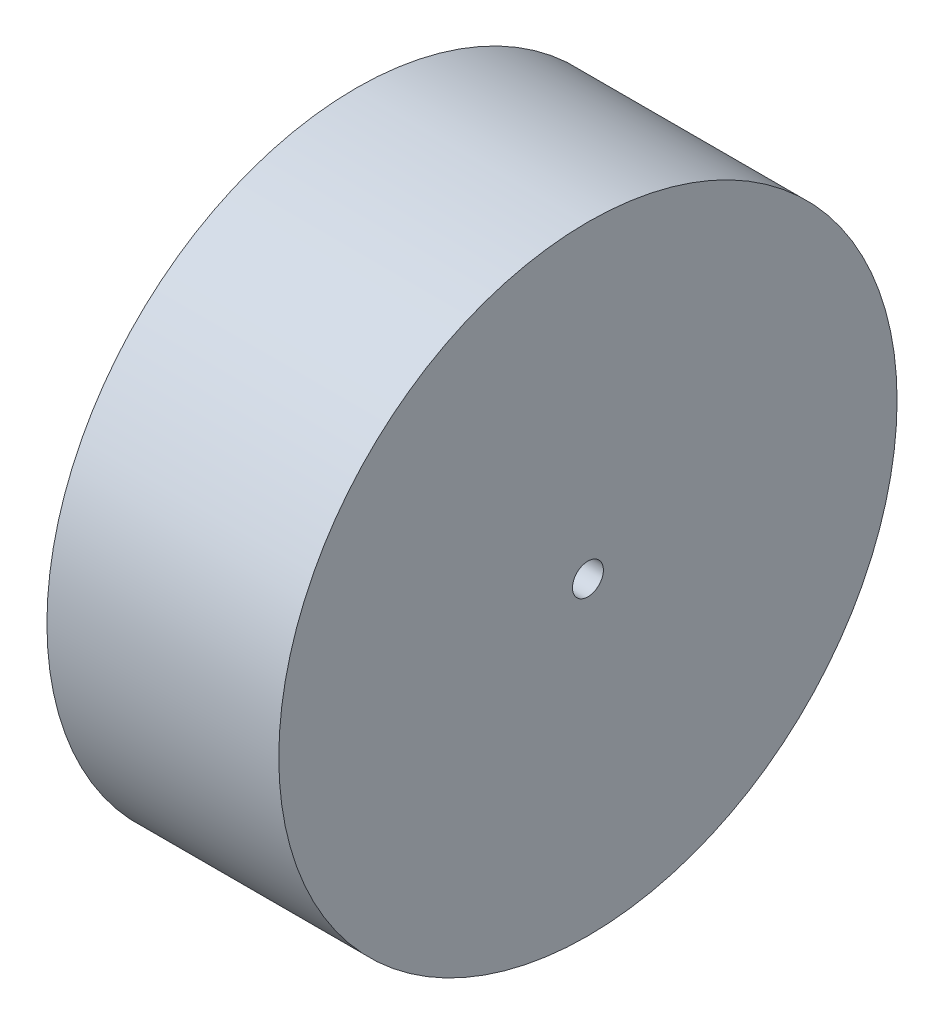
ISO-10303-21;
HEADER;
FILE_DESCRIPTION(('STEP AP214'),'2;1');
FILE_NAME('part.step','',(''),(''),'','','');
FILE_SCHEMA(('AUTOMOTIVE_DESIGN { 1 0 10303 214 1 1 1 1 }'));
ENDSEC;
DATA;
#1=APPLICATION_CONTEXT('core data for automotive mechanical design processes');
#2=APPLICATION_PROTOCOL_DEFINITION('international standard','automotive_design',2000,#1);
#3=PRODUCT_CONTEXT('',#1,'mechanical');
#4=PRODUCT('Part','Part','',(#3));
#5=PRODUCT_RELATED_PRODUCT_CATEGORY('part','',(#4));
#6=PRODUCT_DEFINITION_FORMATION('','',#4);
#7=PRODUCT_DEFINITION_CONTEXT('part definition',#1,'design');
#8=PRODUCT_DEFINITION('design','',#6,#7);
#9=PRODUCT_DEFINITION_SHAPE('','',#8);
#10=(LENGTH_UNIT() NAMED_UNIT(*) SI_UNIT(.MILLI.,.METRE.));
#11=(NAMED_UNIT(*) PLANE_ANGLE_UNIT() SI_UNIT($,.RADIAN.));
#12=(NAMED_UNIT(*) SI_UNIT($,.STERADIAN.) SOLID_ANGLE_UNIT());
#13=UNCERTAINTY_MEASURE_WITH_UNIT(LENGTH_MEASURE(1.E-05),#10,'distance_accuracy_value','');
#14=(GEOMETRIC_REPRESENTATION_CONTEXT(3) GLOBAL_UNCERTAINTY_ASSIGNED_CONTEXT((#13)) GLOBAL_UNIT_ASSIGNED_CONTEXT((#10,
#11,#12)) REPRESENTATION_CONTEXT('',''));
#15=CARTESIAN_POINT('',(0.,0.,0.));
#16=DIRECTION('',(0.,0.,1.));
#17=DIRECTION('',(1.,0.,0.));
#18=AXIS2_PLACEMENT_3D('',#15,#16,#17);
#19=CARTESIAN_POINT('',(15.,0.,0.));
#20=DIRECTION('',(1.,0.,0.));
#21=DIRECTION('',(0.,0.,-1.));
#22=AXIS2_PLACEMENT_3D('',#19,#20,#21);
#23=PLANE('',#22);
#24=CARTESIAN_POINT('',(15.,0.,0.));
#25=DIRECTION('',(1.,0.,0.));
#26=DIRECTION('',(0.,0.,-1.));
#27=AXIS2_PLACEMENT_3D('',#24,#25,#26);
#28=CIRCLE('',#27,20.);
#29=CARTESIAN_POINT('',(15.,0.,-20.));
#30=VERTEX_POINT('',#29);
#31=EDGE_CURVE('E10',#30,#30,#28,.T.);
#32=ORIENTED_EDGE('',*,*,#31,.T.);
#33=EDGE_LOOP('',(#32));
#34=FACE_BOUND('',#33,.T.);
#35=CARTESIAN_POINT('',(15.,0.,0.));
#36=DIRECTION('',(1.,0.,0.));
#37=DIRECTION('',(0.,0.,-1.));
#38=AXIS2_PLACEMENT_3D('',#35,#36,#37);
#39=CIRCLE('',#38,1.);
#40=CARTESIAN_POINT('',(15.,0.,-1.));
#41=VERTEX_POINT('',#40);
#42=EDGE_CURVE('E49',#41,#41,#39,.T.);
#43=ORIENTED_EDGE('',*,*,#42,.F.);
#44=EDGE_LOOP('',(#43));
#45=FACE_BOUND('',#44,.T.);
#46=ADVANCED_FACE('F38',(#34,#45),#23,.T.);
#47=CARTESIAN_POINT('',(0.,0.,0.));
#48=DIRECTION('',(1.,0.,0.));
#49=DIRECTION('',(0.,0.,-1.));
#50=AXIS2_PLACEMENT_3D('',#47,#48,#49);
#51=PLANE('',#50);
#52=CARTESIAN_POINT('',(0.,0.,0.));
#53=DIRECTION('',(1.,0.,0.));
#54=DIRECTION('',(0.,0.,-1.));
#55=AXIS2_PLACEMENT_3D('',#52,#53,#54);
#56=CIRCLE('',#55,20.);
#57=CARTESIAN_POINT('',(0.,0.,-20.));
#58=VERTEX_POINT('',#57);
#59=EDGE_CURVE('E42',#58,#58,#56,.T.);
#60=ORIENTED_EDGE('',*,*,#59,.F.);
#61=EDGE_LOOP('',(#60));
#62=FACE_BOUND('',#61,.T.);
#63=CARTESIAN_POINT('',(0.,0.,0.));
#64=DIRECTION('',(1.,0.,0.));
#65=DIRECTION('',(0.,0.,-1.));
#66=AXIS2_PLACEMENT_3D('',#63,#64,#65);
#67=CIRCLE('',#66,1.);
#68=CARTESIAN_POINT('',(0.,0.,-1.));
#69=VERTEX_POINT('',#68);
#70=EDGE_CURVE('E51',#69,#69,#67,.T.);
#71=ORIENTED_EDGE('',*,*,#70,.T.);
#72=EDGE_LOOP('',(#71));
#73=FACE_BOUND('',#72,.T.);
#74=ADVANCED_FACE('F61',(#62,#73),#51,.F.);
#75=CARTESIAN_POINT('',(15.,0.,0.));
#76=DIRECTION('',(-1.,0.,0.));
#77=DIRECTION('',(0.,0.,1.));
#78=AXIS2_PLACEMENT_3D('',#75,#76,#77);
#79=CYLINDRICAL_SURFACE('',#78,20.);
#80=ORIENTED_EDGE('',*,*,#31,.F.);
#81=EDGE_LOOP('',(#80));
#82=FACE_BOUND('',#81,.T.);
#83=ORIENTED_EDGE('',*,*,#59,.T.);
#84=EDGE_LOOP('',(#83));
#85=FACE_BOUND('',#84,.T.);
#86=ADVANCED_FACE('F40',(#82,#85),#79,.T.);
#87=CARTESIAN_POINT('',(15.,0.,0.));
#88=DIRECTION('',(-1.,0.,0.));
#89=DIRECTION('',(0.,0.,1.));
#90=AXIS2_PLACEMENT_3D('',#87,#88,#89);
#91=CYLINDRICAL_SURFACE('',#90,1.);
#92=ORIENTED_EDGE('',*,*,#42,.T.);
#93=EDGE_LOOP('',(#92));
#94=FACE_BOUND('',#93,.T.);
#95=ORIENTED_EDGE('',*,*,#70,.F.);
#96=EDGE_LOOP('',(#95));
#97=FACE_BOUND('',#96,.T.);
#98=ADVANCED_FACE('F57',(#94,#97),#91,.F.);
#99=CLOSED_SHELL('',(#46,#74,#86,#98));
#100=MANIFOLD_SOLID_BREP('B2',#99);
#101=ADVANCED_BREP_SHAPE_REPRESENTATION('',(#18,#100),#14);
#102=SHAPE_DEFINITION_REPRESENTATION(#9,#101);
ENDSEC;
END-ISO-10303-21;
